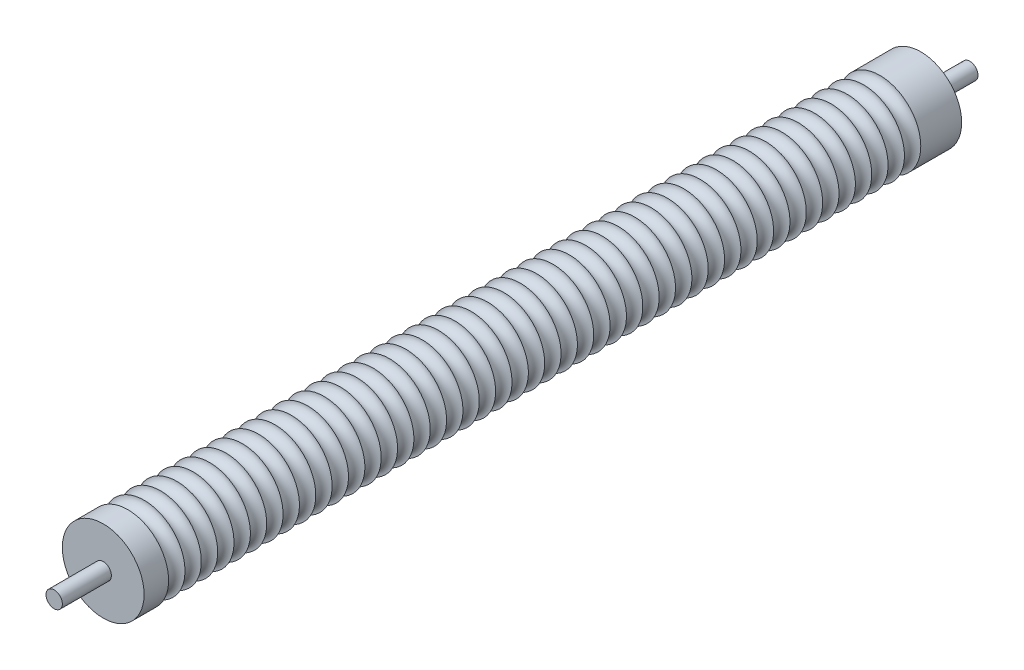
ISO-10303-21;
HEADER;
FILE_DESCRIPTION(('STEP AP214'),'2;1');
FILE_NAME('part.step','',(''),(''),'','','');
FILE_SCHEMA(('AUTOMOTIVE_DESIGN { 1 0 10303 214 1 1 1 1 }'));
ENDSEC;
DATA;
#1=APPLICATION_CONTEXT('core data for automotive mechanical design processes');
#2=APPLICATION_PROTOCOL_DEFINITION('international standard','automotive_design',2000,#1);
#3=PRODUCT_CONTEXT('',#1,'mechanical');
#4=PRODUCT('Part','Part','',(#3));
#5=PRODUCT_RELATED_PRODUCT_CATEGORY('part','',(#4));
#6=PRODUCT_DEFINITION_FORMATION('','',#4);
#7=PRODUCT_DEFINITION_CONTEXT('part definition',#1,'design');
#8=PRODUCT_DEFINITION('design','',#6,#7);
#9=PRODUCT_DEFINITION_SHAPE('','',#8);
#10=(LENGTH_UNIT() NAMED_UNIT(*) SI_UNIT(.MILLI.,.METRE.));
#11=(NAMED_UNIT(*) PLANE_ANGLE_UNIT() SI_UNIT($,.RADIAN.));
#12=(NAMED_UNIT(*) SI_UNIT($,.STERADIAN.) SOLID_ANGLE_UNIT());
#13=UNCERTAINTY_MEASURE_WITH_UNIT(LENGTH_MEASURE(1.E-05),#10,'distance_accuracy_value','');
#14=(GEOMETRIC_REPRESENTATION_CONTEXT(3) GLOBAL_UNCERTAINTY_ASSIGNED_CONTEXT((#13)) GLOBAL_UNIT_ASSIGNED_CONTEXT((#10,
#11,#12)) REPRESENTATION_CONTEXT('',''));
#15=CARTESIAN_POINT('',(0.,0.,0.));
#16=DIRECTION('',(0.,0.,1.));
#17=DIRECTION('',(1.,0.,0.));
#18=AXIS2_PLACEMENT_3D('',#15,#16,#17);
#19=CARTESIAN_POINT('',(1.17961196366423E-13,0.,960.));
#20=DIRECTION('',(0.,0.,-1.));
#21=DIRECTION('',(-1.,0.,0.));
#22=AXIS2_PLACEMENT_3D('',#19,#20,#21);
#23=TOROIDAL_SURFACE('',#22,50.0000000000001,10.);
#24=CARTESIAN_POINT('',(1.19210197269126E-13,0.,970.));
#25=DIRECTION('',(0.,0.,-1.));
#26=DIRECTION('',(-1.,0.,0.));
#27=AXIS2_PLACEMENT_3D('',#24,#25,#26);
#28=CIRCLE('',#27,50.);
#29=CARTESIAN_POINT('',(-49.9999999999999,0.,970.));
#30=VERTEX_POINT('',#29);
#31=EDGE_CURVE('E53',#30,#30,#28,.F.);
#32=ORIENTED_EDGE('',*,*,#31,.F.);
#33=EDGE_LOOP('',(#32));
#34=FACE_BOUND('',#33,.T.);
#35=CARTESIAN_POINT('',(1.17961196366423E-13,0.,950.));
#36=DIRECTION('',(0.,0.,-1.));
#37=DIRECTION('',(-1.,0.,0.));
#38=AXIS2_PLACEMENT_3D('',#35,#36,#37);
#39=CIRCLE('',#38,50.0000000000001);
#40=CARTESIAN_POINT('',(-50.,0.,950.));
#41=VERTEX_POINT('',#40);
#42=EDGE_CURVE('E67',#41,#41,#39,.T.);
#43=ORIENTED_EDGE('',*,*,#42,.F.);
#44=EDGE_LOOP('',(#43));
#45=FACE_BOUND('',#44,.T.);
#46=ADVANCED_FACE('F33',(#34,#45),#23,.F.);
#47=CARTESIAN_POINT('',(0.,0.,1000.));
#48=DIRECTION('',(0.,0.,1.));
#49=DIRECTION('',(1.,0.,0.));
#50=AXIS2_PLACEMENT_3D('',#47,#48,#49);
#51=PLANE('',#50);
#52=CARTESIAN_POINT('',(0.,0.,1000.));
#53=DIRECTION('',(0.,0.,1.));
#54=DIRECTION('',(1.,0.,0.));
#55=AXIS2_PLACEMENT_3D('',#52,#53,#54);
#56=CIRCLE('',#55,10.);
#57=CARTESIAN_POINT('',(10.,0.,1000.));
#58=VERTEX_POINT('',#57);
#59=EDGE_CURVE('E10',#58,#58,#56,.T.);
#60=ORIENTED_EDGE('',*,*,#59,.F.);
#61=EDGE_LOOP('',(#60));
#62=FACE_BOUND('',#61,.T.);
#63=CARTESIAN_POINT('',(0.,0.,1000.));
#64=DIRECTION('',(0.,0.,1.));
#65=DIRECTION('',(1.,0.,0.));
#66=AXIS2_PLACEMENT_3D('',#63,#64,#65);
#67=CIRCLE('',#66,50.);
#68=CARTESIAN_POINT('',(50.,0.,1000.));
#69=VERTEX_POINT('',#68);
#70=EDGE_CURVE('E41',#69,#69,#67,.T.);
#71=ORIENTED_EDGE('',*,*,#70,.T.);
#72=EDGE_LOOP('',(#71));
#73=FACE_BOUND('',#72,.T.);
#74=ADVANCED_FACE('F227',(#62,#73),#51,.T.);
#75=CARTESIAN_POINT('',(0.,0.,1000.));
#76=DIRECTION('',(0.,0.,-1.));
#77=DIRECTION('',(-1.,0.,0.));
#78=AXIS2_PLACEMENT_3D('',#75,#76,#77);
#79=CYLINDRICAL_SURFACE('',#78,50.);
#80=ORIENTED_EDGE('',*,*,#31,.T.);
#81=EDGE_LOOP('',(#80));
#82=FACE_BOUND('',#81,.T.);
#83=ORIENTED_EDGE('',*,*,#70,.F.);
#84=EDGE_LOOP('',(#83));
#85=FACE_BOUND('',#84,.T.);
#86=ADVANCED_FACE('F35',(#82,#85),#79,.T.);
#87=CARTESIAN_POINT('',(0.,0.,1060.));
#88=DIRECTION('',(0.,0.,-1.));
#89=DIRECTION('',(-1.,0.,0.));
#90=AXIS2_PLACEMENT_3D('',#87,#88,#89);
#91=CYLINDRICAL_SURFACE('',#90,10.);
#92=CARTESIAN_POINT('',(0.,0.,1060.));
#93=DIRECTION('',(0.,0.,1.));
#94=DIRECTION('',(1.,0.,0.));
#95=AXIS2_PLACEMENT_3D('',#92,#93,#94);
#96=CIRCLE('',#95,10.);
#97=CARTESIAN_POINT('',(10.,0.,1060.));
#98=VERTEX_POINT('',#97);
#99=EDGE_CURVE('E49',#98,#98,#96,.T.);
#100=ORIENTED_EDGE('',*,*,#99,.F.);
#101=EDGE_LOOP('',(#100));
#102=FACE_BOUND('',#101,.T.);
#103=ORIENTED_EDGE('',*,*,#59,.T.);
#104=EDGE_LOOP('',(#103));
#105=FACE_BOUND('',#104,.T.);
#106=ADVANCED_FACE('F237',(#102,#105),#91,.T.);
#107=CARTESIAN_POINT('',(0.,0.,1060.));
#108=DIRECTION('',(0.,0.,1.));
#109=DIRECTION('',(1.,0.,0.));
#110=AXIS2_PLACEMENT_3D('',#107,#108,#109);
#111=PLANE('',#110);
#112=ORIENTED_EDGE('',*,*,#99,.T.);
#113=EDGE_LOOP('',(#112));
#114=FACE_BOUND('',#113,.T.);
#115=ADVANCED_FACE('F254',(#114),#111,.T.);
#116=CARTESIAN_POINT('',(1.17961196366423E-13,0.,940.));
#117=DIRECTION('',(0.,0.,-1.));
#118=DIRECTION('',(-1.,0.,0.));
#119=AXIS2_PLACEMENT_3D('',#116,#117,#118);
#120=TOROIDAL_SURFACE('',#119,50.0000000000001,10.);
#121=ORIENTED_EDGE('',*,*,#42,.T.);
#122=EDGE_LOOP('',(#121));
#123=FACE_BOUND('',#122,.T.);
#124=CARTESIAN_POINT('',(1.19210197269126E-13,0.,930.));
#125=DIRECTION('',(0.,0.,-1.));
#126=DIRECTION('',(-1.,0.,0.));
#127=AXIS2_PLACEMENT_3D('',#124,#125,#126);
#128=CIRCLE('',#127,50.);
#129=CARTESIAN_POINT('',(-49.9999999999999,0.,930.));
#130=VERTEX_POINT('',#129);
#131=EDGE_CURVE('E71',#130,#130,#128,.F.);
#132=ORIENTED_EDGE('',*,*,#131,.T.);
#133=EDGE_LOOP('',(#132));
#134=FACE_BOUND('',#133,.T.);
#135=ADVANCED_FACE('F256',(#123,#134),#120,.F.);
#136=CARTESIAN_POINT('',(1.17961196366423E-13,0.,920.));
#137=DIRECTION('',(0.,0.,-1.));
#138=DIRECTION('',(-1.,0.,0.));
#139=AXIS2_PLACEMENT_3D('',#136,#137,#138);
#140=TOROIDAL_SURFACE('',#139,50.0000000000001,10.);
#141=ORIENTED_EDGE('',*,*,#131,.F.);
#142=EDGE_LOOP('',(#141));
#143=FACE_BOUND('',#142,.T.);
#144=CARTESIAN_POINT('',(1.19210197269126E-13,0.,910.));
#145=DIRECTION('',(0.,0.,-1.));
#146=DIRECTION('',(-1.,0.,0.));
#147=AXIS2_PLACEMENT_3D('',#144,#145,#146);
#148=CIRCLE('',#147,50.);
#149=CARTESIAN_POINT('',(-49.9999999999999,0.,910.));
#150=VERTEX_POINT('',#149);
#151=EDGE_CURVE('E74',#150,#150,#148,.F.);
#152=ORIENTED_EDGE('',*,*,#151,.T.);
#153=EDGE_LOOP('',(#152));
#154=FACE_BOUND('',#153,.T.);
#155=ADVANCED_FACE('F261',(#143,#154),#140,.F.);
#156=CARTESIAN_POINT('',(1.17961196366423E-13,0.,900.));
#157=DIRECTION('',(0.,0.,-1.));
#158=DIRECTION('',(-1.,0.,0.));
#159=AXIS2_PLACEMENT_3D('',#156,#157,#158);
#160=TOROIDAL_SURFACE('',#159,50.0000000000001,10.);
#161=ORIENTED_EDGE('',*,*,#151,.F.);
#162=EDGE_LOOP('',(#161));
#163=FACE_BOUND('',#162,.T.);
#164=CARTESIAN_POINT('',(1.19210197269126E-13,0.,890.));
#165=DIRECTION('',(0.,0.,-1.));
#166=DIRECTION('',(-1.,0.,0.));
#167=AXIS2_PLACEMENT_3D('',#164,#165,#166);
#168=CIRCLE('',#167,50.);
#169=CARTESIAN_POINT('',(-49.9999999999999,0.,890.));
#170=VERTEX_POINT('',#169);
#171=EDGE_CURVE('E77',#170,#170,#168,.F.);
#172=ORIENTED_EDGE('',*,*,#171,.T.);
#173=EDGE_LOOP('',(#172));
#174=FACE_BOUND('',#173,.T.);
#175=ADVANCED_FACE('F315',(#163,#174),#160,.F.);
#176=CARTESIAN_POINT('',(1.17961196366423E-13,0.,880.));
#177=DIRECTION('',(0.,0.,-1.));
#178=DIRECTION('',(-1.,0.,0.));
#179=AXIS2_PLACEMENT_3D('',#176,#177,#178);
#180=TOROIDAL_SURFACE('',#179,50.0000000000001,10.);
#181=ORIENTED_EDGE('',*,*,#171,.F.);
#182=EDGE_LOOP('',(#181));
#183=FACE_BOUND('',#182,.T.);
#184=CARTESIAN_POINT('',(1.19210197269126E-13,0.,870.));
#185=DIRECTION('',(0.,0.,-1.));
#186=DIRECTION('',(-1.,0.,0.));
#187=AXIS2_PLACEMENT_3D('',#184,#185,#186);
#188=CIRCLE('',#187,50.);
#189=CARTESIAN_POINT('',(-49.9999999999999,0.,870.));
#190=VERTEX_POINT('',#189);
#191=EDGE_CURVE('E80',#190,#190,#188,.F.);
#192=ORIENTED_EDGE('',*,*,#191,.T.);
#193=EDGE_LOOP('',(#192));
#194=FACE_BOUND('',#193,.T.);
#195=ADVANCED_FACE('F325',(#183,#194),#180,.F.);
#196=CARTESIAN_POINT('',(1.17961196366423E-13,0.,860.));
#197=DIRECTION('',(0.,0.,-1.));
#198=DIRECTION('',(-1.,0.,0.));
#199=AXIS2_PLACEMENT_3D('',#196,#197,#198);
#200=TOROIDAL_SURFACE('',#199,50.0000000000001,10.);
#201=ORIENTED_EDGE('',*,*,#191,.F.);
#202=EDGE_LOOP('',(#201));
#203=FACE_BOUND('',#202,.T.);
#204=CARTESIAN_POINT('',(1.19210197269126E-13,0.,850.));
#205=DIRECTION('',(0.,0.,-1.));
#206=DIRECTION('',(-1.,0.,0.));
#207=AXIS2_PLACEMENT_3D('',#204,#205,#206);
#208=CIRCLE('',#207,50.);
#209=CARTESIAN_POINT('',(-49.9999999999999,0.,850.));
#210=VERTEX_POINT('',#209);
#211=EDGE_CURVE('E83',#210,#210,#208,.F.);
#212=ORIENTED_EDGE('',*,*,#211,.T.);
#213=EDGE_LOOP('',(#212));
#214=FACE_BOUND('',#213,.T.);
#215=ADVANCED_FACE('F335',(#203,#214),#200,.F.);
#216=CARTESIAN_POINT('',(1.17961196366423E-13,0.,840.));
#217=DIRECTION('',(0.,0.,-1.));
#218=DIRECTION('',(-1.,0.,0.));
#219=AXIS2_PLACEMENT_3D('',#216,#217,#218);
#220=TOROIDAL_SURFACE('',#219,50.0000000000001,10.);
#221=ORIENTED_EDGE('',*,*,#211,.F.);
#222=EDGE_LOOP('',(#221));
#223=FACE_BOUND('',#222,.T.);
#224=CARTESIAN_POINT('',(1.19210197269126E-13,0.,830.));
#225=DIRECTION('',(0.,0.,-1.));
#226=DIRECTION('',(-1.,0.,0.));
#227=AXIS2_PLACEMENT_3D('',#224,#225,#226);
#228=CIRCLE('',#227,50.);
#229=CARTESIAN_POINT('',(-49.9999999999999,0.,830.));
#230=VERTEX_POINT('',#229);
#231=EDGE_CURVE('E86',#230,#230,#228,.F.);
#232=ORIENTED_EDGE('',*,*,#231,.T.);
#233=EDGE_LOOP('',(#232));
#234=FACE_BOUND('',#233,.T.);
#235=ADVANCED_FACE('F345',(#223,#234),#220,.F.);
#236=CARTESIAN_POINT('',(1.17961196366423E-13,0.,820.));
#237=DIRECTION('',(0.,0.,-1.));
#238=DIRECTION('',(-1.,0.,0.));
#239=AXIS2_PLACEMENT_3D('',#236,#237,#238);
#240=TOROIDAL_SURFACE('',#239,50.0000000000001,10.);
#241=ORIENTED_EDGE('',*,*,#231,.F.);
#242=EDGE_LOOP('',(#241));
#243=FACE_BOUND('',#242,.T.);
#244=CARTESIAN_POINT('',(1.19210197269126E-13,0.,810.));
#245=DIRECTION('',(0.,0.,-1.));
#246=DIRECTION('',(-1.,0.,0.));
#247=AXIS2_PLACEMENT_3D('',#244,#245,#246);
#248=CIRCLE('',#247,50.);
#249=CARTESIAN_POINT('',(-49.9999999999999,0.,810.));
#250=VERTEX_POINT('',#249);
#251=EDGE_CURVE('E89',#250,#250,#248,.F.);
#252=ORIENTED_EDGE('',*,*,#251,.T.);
#253=EDGE_LOOP('',(#252));
#254=FACE_BOUND('',#253,.T.);
#255=ADVANCED_FACE('F355',(#243,#254),#240,.F.);
#256=CARTESIAN_POINT('',(1.17961196366423E-13,0.,800.));
#257=DIRECTION('',(0.,0.,-1.));
#258=DIRECTION('',(-1.,0.,0.));
#259=AXIS2_PLACEMENT_3D('',#256,#257,#258);
#260=TOROIDAL_SURFACE('',#259,50.0000000000001,10.);
#261=ORIENTED_EDGE('',*,*,#251,.F.);
#262=EDGE_LOOP('',(#261));
#263=FACE_BOUND('',#262,.T.);
#264=CARTESIAN_POINT('',(1.19210197269126E-13,0.,790.));
#265=DIRECTION('',(0.,0.,-1.));
#266=DIRECTION('',(-1.,0.,0.));
#267=AXIS2_PLACEMENT_3D('',#264,#265,#266);
#268=CIRCLE('',#267,50.);
#269=CARTESIAN_POINT('',(-49.9999999999999,0.,790.));
#270=VERTEX_POINT('',#269);
#271=EDGE_CURVE('E92',#270,#270,#268,.F.);
#272=ORIENTED_EDGE('',*,*,#271,.T.);
#273=EDGE_LOOP('',(#272));
#274=FACE_BOUND('',#273,.T.);
#275=ADVANCED_FACE('F365',(#263,#274),#260,.F.);
#276=CARTESIAN_POINT('',(1.17961196366423E-13,0.,780.));
#277=DIRECTION('',(0.,0.,-1.));
#278=DIRECTION('',(-1.,0.,0.));
#279=AXIS2_PLACEMENT_3D('',#276,#277,#278);
#280=TOROIDAL_SURFACE('',#279,50.0000000000001,10.);
#281=ORIENTED_EDGE('',*,*,#271,.F.);
#282=EDGE_LOOP('',(#281));
#283=FACE_BOUND('',#282,.T.);
#284=CARTESIAN_POINT('',(1.19210197269126E-13,0.,770.));
#285=DIRECTION('',(0.,0.,-1.));
#286=DIRECTION('',(-1.,0.,0.));
#287=AXIS2_PLACEMENT_3D('',#284,#285,#286);
#288=CIRCLE('',#287,50.);
#289=CARTESIAN_POINT('',(-49.9999999999999,0.,770.));
#290=VERTEX_POINT('',#289);
#291=EDGE_CURVE('E95',#290,#290,#288,.F.);
#292=ORIENTED_EDGE('',*,*,#291,.T.);
#293=EDGE_LOOP('',(#292));
#294=FACE_BOUND('',#293,.T.);
#295=ADVANCED_FACE('F375',(#283,#294),#280,.F.);
#296=CARTESIAN_POINT('',(1.17961196366423E-13,0.,760.));
#297=DIRECTION('',(0.,0.,-1.));
#298=DIRECTION('',(-1.,0.,0.));
#299=AXIS2_PLACEMENT_3D('',#296,#297,#298);
#300=TOROIDAL_SURFACE('',#299,50.0000000000001,10.);
#301=ORIENTED_EDGE('',*,*,#291,.F.);
#302=EDGE_LOOP('',(#301));
#303=FACE_BOUND('',#302,.T.);
#304=CARTESIAN_POINT('',(1.19210197269126E-13,0.,750.));
#305=DIRECTION('',(0.,0.,-1.));
#306=DIRECTION('',(-1.,0.,0.));
#307=AXIS2_PLACEMENT_3D('',#304,#305,#306);
#308=CIRCLE('',#307,50.);
#309=CARTESIAN_POINT('',(-49.9999999999999,0.,750.));
#310=VERTEX_POINT('',#309);
#311=EDGE_CURVE('E98',#310,#310,#308,.F.);
#312=ORIENTED_EDGE('',*,*,#311,.T.);
#313=EDGE_LOOP('',(#312));
#314=FACE_BOUND('',#313,.T.);
#315=ADVANCED_FACE('F385',(#303,#314),#300,.F.);
#316=CARTESIAN_POINT('',(1.17961196366423E-13,0.,740.));
#317=DIRECTION('',(0.,0.,-1.));
#318=DIRECTION('',(-1.,0.,0.));
#319=AXIS2_PLACEMENT_3D('',#316,#317,#318);
#320=TOROIDAL_SURFACE('',#319,50.0000000000001,10.);
#321=ORIENTED_EDGE('',*,*,#311,.F.);
#322=EDGE_LOOP('',(#321));
#323=FACE_BOUND('',#322,.T.);
#324=CARTESIAN_POINT('',(1.19210197269126E-13,0.,730.));
#325=DIRECTION('',(0.,0.,-1.));
#326=DIRECTION('',(-1.,0.,0.));
#327=AXIS2_PLACEMENT_3D('',#324,#325,#326);
#328=CIRCLE('',#327,50.);
#329=CARTESIAN_POINT('',(-49.9999999999999,0.,730.));
#330=VERTEX_POINT('',#329);
#331=EDGE_CURVE('E101',#330,#330,#328,.F.);
#332=ORIENTED_EDGE('',*,*,#331,.T.);
#333=EDGE_LOOP('',(#332));
#334=FACE_BOUND('',#333,.T.);
#335=ADVANCED_FACE('F395',(#323,#334),#320,.F.);
#336=CARTESIAN_POINT('',(1.17961196366423E-13,0.,720.));
#337=DIRECTION('',(0.,0.,-1.));
#338=DIRECTION('',(-1.,0.,0.));
#339=AXIS2_PLACEMENT_3D('',#336,#337,#338);
#340=TOROIDAL_SURFACE('',#339,50.0000000000001,10.);
#341=ORIENTED_EDGE('',*,*,#331,.F.);
#342=EDGE_LOOP('',(#341));
#343=FACE_BOUND('',#342,.T.);
#344=CARTESIAN_POINT('',(1.19210197269126E-13,0.,710.));
#345=DIRECTION('',(0.,0.,-1.));
#346=DIRECTION('',(-1.,0.,0.));
#347=AXIS2_PLACEMENT_3D('',#344,#345,#346);
#348=CIRCLE('',#347,50.);
#349=CARTESIAN_POINT('',(-49.9999999999999,0.,710.));
#350=VERTEX_POINT('',#349);
#351=EDGE_CURVE('E104',#350,#350,#348,.F.);
#352=ORIENTED_EDGE('',*,*,#351,.T.);
#353=EDGE_LOOP('',(#352));
#354=FACE_BOUND('',#353,.T.);
#355=ADVANCED_FACE('F405',(#343,#354),#340,.F.);
#356=CARTESIAN_POINT('',(1.17961196366423E-13,0.,700.));
#357=DIRECTION('',(0.,0.,-1.));
#358=DIRECTION('',(-1.,0.,0.));
#359=AXIS2_PLACEMENT_3D('',#356,#357,#358);
#360=TOROIDAL_SURFACE('',#359,50.0000000000001,10.);
#361=ORIENTED_EDGE('',*,*,#351,.F.);
#362=EDGE_LOOP('',(#361));
#363=FACE_BOUND('',#362,.T.);
#364=CARTESIAN_POINT('',(1.19210197269126E-13,0.,690.));
#365=DIRECTION('',(0.,0.,-1.));
#366=DIRECTION('',(-1.,0.,0.));
#367=AXIS2_PLACEMENT_3D('',#364,#365,#366);
#368=CIRCLE('',#367,50.);
#369=CARTESIAN_POINT('',(-49.9999999999999,0.,690.));
#370=VERTEX_POINT('',#369);
#371=EDGE_CURVE('E107',#370,#370,#368,.F.);
#372=ORIENTED_EDGE('',*,*,#371,.T.);
#373=EDGE_LOOP('',(#372));
#374=FACE_BOUND('',#373,.T.);
#375=ADVANCED_FACE('F415',(#363,#374),#360,.F.);
#376=CARTESIAN_POINT('',(1.17961196366423E-13,0.,680.));
#377=DIRECTION('',(0.,0.,-1.));
#378=DIRECTION('',(-1.,0.,0.));
#379=AXIS2_PLACEMENT_3D('',#376,#377,#378);
#380=TOROIDAL_SURFACE('',#379,50.0000000000001,10.);
#381=ORIENTED_EDGE('',*,*,#371,.F.);
#382=EDGE_LOOP('',(#381));
#383=FACE_BOUND('',#382,.T.);
#384=CARTESIAN_POINT('',(1.19210197269126E-13,0.,670.));
#385=DIRECTION('',(0.,0.,-1.));
#386=DIRECTION('',(-1.,0.,0.));
#387=AXIS2_PLACEMENT_3D('',#384,#385,#386);
#388=CIRCLE('',#387,50.);
#389=CARTESIAN_POINT('',(-49.9999999999999,0.,670.));
#390=VERTEX_POINT('',#389);
#391=EDGE_CURVE('E110',#390,#390,#388,.F.);
#392=ORIENTED_EDGE('',*,*,#391,.T.);
#393=EDGE_LOOP('',(#392));
#394=FACE_BOUND('',#393,.T.);
#395=ADVANCED_FACE('F425',(#383,#394),#380,.F.);
#396=CARTESIAN_POINT('',(1.17961196366423E-13,0.,660.));
#397=DIRECTION('',(0.,0.,-1.));
#398=DIRECTION('',(-1.,0.,0.));
#399=AXIS2_PLACEMENT_3D('',#396,#397,#398);
#400=TOROIDAL_SURFACE('',#399,50.0000000000001,10.);
#401=ORIENTED_EDGE('',*,*,#391,.F.);
#402=EDGE_LOOP('',(#401));
#403=FACE_BOUND('',#402,.T.);
#404=CARTESIAN_POINT('',(1.19210197269126E-13,0.,650.));
#405=DIRECTION('',(0.,0.,-1.));
#406=DIRECTION('',(-1.,0.,0.));
#407=AXIS2_PLACEMENT_3D('',#404,#405,#406);
#408=CIRCLE('',#407,50.);
#409=CARTESIAN_POINT('',(-49.9999999999999,0.,650.));
#410=VERTEX_POINT('',#409);
#411=EDGE_CURVE('E113',#410,#410,#408,.F.);
#412=ORIENTED_EDGE('',*,*,#411,.T.);
#413=EDGE_LOOP('',(#412));
#414=FACE_BOUND('',#413,.T.);
#415=ADVANCED_FACE('F435',(#403,#414),#400,.F.);
#416=CARTESIAN_POINT('',(1.17961196366423E-13,0.,640.));
#417=DIRECTION('',(0.,0.,-1.));
#418=DIRECTION('',(-1.,0.,0.));
#419=AXIS2_PLACEMENT_3D('',#416,#417,#418);
#420=TOROIDAL_SURFACE('',#419,50.0000000000001,10.);
#421=ORIENTED_EDGE('',*,*,#411,.F.);
#422=EDGE_LOOP('',(#421));
#423=FACE_BOUND('',#422,.T.);
#424=CARTESIAN_POINT('',(1.19210197269126E-13,0.,630.));
#425=DIRECTION('',(0.,0.,-1.));
#426=DIRECTION('',(-1.,0.,0.));
#427=AXIS2_PLACEMENT_3D('',#424,#425,#426);
#428=CIRCLE('',#427,50.);
#429=CARTESIAN_POINT('',(-49.9999999999999,0.,630.));
#430=VERTEX_POINT('',#429);
#431=EDGE_CURVE('E116',#430,#430,#428,.F.);
#432=ORIENTED_EDGE('',*,*,#431,.T.);
#433=EDGE_LOOP('',(#432));
#434=FACE_BOUND('',#433,.T.);
#435=ADVANCED_FACE('F445',(#423,#434),#420,.F.);
#436=CARTESIAN_POINT('',(1.17961196366423E-13,0.,620.));
#437=DIRECTION('',(0.,0.,-1.));
#438=DIRECTION('',(-1.,0.,0.));
#439=AXIS2_PLACEMENT_3D('',#436,#437,#438);
#440=TOROIDAL_SURFACE('',#439,50.0000000000001,10.);
#441=ORIENTED_EDGE('',*,*,#431,.F.);
#442=EDGE_LOOP('',(#441));
#443=FACE_BOUND('',#442,.T.);
#444=CARTESIAN_POINT('',(1.19210197269126E-13,0.,610.));
#445=DIRECTION('',(0.,0.,-1.));
#446=DIRECTION('',(-1.,0.,0.));
#447=AXIS2_PLACEMENT_3D('',#444,#445,#446);
#448=CIRCLE('',#447,50.);
#449=CARTESIAN_POINT('',(-49.9999999999999,0.,610.));
#450=VERTEX_POINT('',#449);
#451=EDGE_CURVE('E119',#450,#450,#448,.F.);
#452=ORIENTED_EDGE('',*,*,#451,.T.);
#453=EDGE_LOOP('',(#452));
#454=FACE_BOUND('',#453,.T.);
#455=ADVANCED_FACE('F455',(#443,#454),#440,.F.);
#456=CARTESIAN_POINT('',(1.17961196366423E-13,0.,600.));
#457=DIRECTION('',(0.,0.,-1.));
#458=DIRECTION('',(-1.,0.,0.));
#459=AXIS2_PLACEMENT_3D('',#456,#457,#458);
#460=TOROIDAL_SURFACE('',#459,50.0000000000001,10.);
#461=ORIENTED_EDGE('',*,*,#451,.F.);
#462=EDGE_LOOP('',(#461));
#463=FACE_BOUND('',#462,.T.);
#464=CARTESIAN_POINT('',(1.19210197269126E-13,0.,590.));
#465=DIRECTION('',(0.,0.,-1.));
#466=DIRECTION('',(-1.,0.,0.));
#467=AXIS2_PLACEMENT_3D('',#464,#465,#466);
#468=CIRCLE('',#467,50.);
#469=CARTESIAN_POINT('',(-49.9999999999999,0.,590.));
#470=VERTEX_POINT('',#469);
#471=EDGE_CURVE('E122',#470,#470,#468,.F.);
#472=ORIENTED_EDGE('',*,*,#471,.T.);
#473=EDGE_LOOP('',(#472));
#474=FACE_BOUND('',#473,.T.);
#475=ADVANCED_FACE('F465',(#463,#474),#460,.F.);
#476=CARTESIAN_POINT('',(1.17961196366423E-13,0.,580.));
#477=DIRECTION('',(0.,0.,-1.));
#478=DIRECTION('',(-1.,0.,0.));
#479=AXIS2_PLACEMENT_3D('',#476,#477,#478);
#480=TOROIDAL_SURFACE('',#479,50.0000000000001,10.);
#481=ORIENTED_EDGE('',*,*,#471,.F.);
#482=EDGE_LOOP('',(#481));
#483=FACE_BOUND('',#482,.T.);
#484=CARTESIAN_POINT('',(1.19210197269126E-13,0.,570.));
#485=DIRECTION('',(0.,0.,-1.));
#486=DIRECTION('',(-1.,0.,0.));
#487=AXIS2_PLACEMENT_3D('',#484,#485,#486);
#488=CIRCLE('',#487,50.);
#489=CARTESIAN_POINT('',(-49.9999999999999,0.,570.));
#490=VERTEX_POINT('',#489);
#491=EDGE_CURVE('E125',#490,#490,#488,.F.);
#492=ORIENTED_EDGE('',*,*,#491,.T.);
#493=EDGE_LOOP('',(#492));
#494=FACE_BOUND('',#493,.T.);
#495=ADVANCED_FACE('F475',(#483,#494),#480,.F.);
#496=CARTESIAN_POINT('',(1.17961196366423E-13,0.,560.));
#497=DIRECTION('',(0.,0.,-1.));
#498=DIRECTION('',(-1.,0.,0.));
#499=AXIS2_PLACEMENT_3D('',#496,#497,#498);
#500=TOROIDAL_SURFACE('',#499,50.0000000000001,10.);
#501=ORIENTED_EDGE('',*,*,#491,.F.);
#502=EDGE_LOOP('',(#501));
#503=FACE_BOUND('',#502,.T.);
#504=CARTESIAN_POINT('',(1.19210197269126E-13,0.,550.));
#505=DIRECTION('',(0.,0.,-1.));
#506=DIRECTION('',(-1.,0.,0.));
#507=AXIS2_PLACEMENT_3D('',#504,#505,#506);
#508=CIRCLE('',#507,50.);
#509=CARTESIAN_POINT('',(-49.9999999999999,0.,550.));
#510=VERTEX_POINT('',#509);
#511=EDGE_CURVE('E128',#510,#510,#508,.F.);
#512=ORIENTED_EDGE('',*,*,#511,.T.);
#513=EDGE_LOOP('',(#512));
#514=FACE_BOUND('',#513,.T.);
#515=ADVANCED_FACE('F485',(#503,#514),#500,.F.);
#516=CARTESIAN_POINT('',(1.17961196366423E-13,0.,540.));
#517=DIRECTION('',(0.,0.,-1.));
#518=DIRECTION('',(-1.,0.,0.));
#519=AXIS2_PLACEMENT_3D('',#516,#517,#518);
#520=TOROIDAL_SURFACE('',#519,50.0000000000001,10.);
#521=ORIENTED_EDGE('',*,*,#511,.F.);
#522=EDGE_LOOP('',(#521));
#523=FACE_BOUND('',#522,.T.);
#524=CARTESIAN_POINT('',(1.19210197269126E-13,0.,530.));
#525=DIRECTION('',(0.,0.,-1.));
#526=DIRECTION('',(-1.,0.,0.));
#527=AXIS2_PLACEMENT_3D('',#524,#525,#526);
#528=CIRCLE('',#527,50.);
#529=CARTESIAN_POINT('',(-49.9999999999999,0.,530.));
#530=VERTEX_POINT('',#529);
#531=EDGE_CURVE('E131',#530,#530,#528,.F.);
#532=ORIENTED_EDGE('',*,*,#531,.T.);
#533=EDGE_LOOP('',(#532));
#534=FACE_BOUND('',#533,.T.);
#535=ADVANCED_FACE('F495',(#523,#534),#520,.F.);
#536=CARTESIAN_POINT('',(1.17961196366423E-13,0.,520.));
#537=DIRECTION('',(0.,0.,-1.));
#538=DIRECTION('',(-1.,0.,0.));
#539=AXIS2_PLACEMENT_3D('',#536,#537,#538);
#540=TOROIDAL_SURFACE('',#539,50.0000000000001,10.);
#541=ORIENTED_EDGE('',*,*,#531,.F.);
#542=EDGE_LOOP('',(#541));
#543=FACE_BOUND('',#542,.T.);
#544=CARTESIAN_POINT('',(1.19210197269126E-13,0.,510.));
#545=DIRECTION('',(0.,0.,-1.));
#546=DIRECTION('',(-1.,0.,0.));
#547=AXIS2_PLACEMENT_3D('',#544,#545,#546);
#548=CIRCLE('',#547,50.);
#549=CARTESIAN_POINT('',(-49.9999999999999,0.,510.));
#550=VERTEX_POINT('',#549);
#551=EDGE_CURVE('E134',#550,#550,#548,.F.);
#552=ORIENTED_EDGE('',*,*,#551,.T.);
#553=EDGE_LOOP('',(#552));
#554=FACE_BOUND('',#553,.T.);
#555=ADVANCED_FACE('F505',(#543,#554),#540,.F.);
#556=CARTESIAN_POINT('',(1.17961196366423E-13,0.,500.));
#557=DIRECTION('',(0.,0.,-1.));
#558=DIRECTION('',(-1.,0.,0.));
#559=AXIS2_PLACEMENT_3D('',#556,#557,#558);
#560=TOROIDAL_SURFACE('',#559,50.0000000000001,10.);
#561=ORIENTED_EDGE('',*,*,#551,.F.);
#562=EDGE_LOOP('',(#561));
#563=FACE_BOUND('',#562,.T.);
#564=CARTESIAN_POINT('',(1.19210197269126E-13,0.,490.));
#565=DIRECTION('',(0.,0.,-1.));
#566=DIRECTION('',(-1.,0.,0.));
#567=AXIS2_PLACEMENT_3D('',#564,#565,#566);
#568=CIRCLE('',#567,50.);
#569=CARTESIAN_POINT('',(-49.9999999999999,0.,490.));
#570=VERTEX_POINT('',#569);
#571=EDGE_CURVE('E137',#570,#570,#568,.F.);
#572=ORIENTED_EDGE('',*,*,#571,.T.);
#573=EDGE_LOOP('',(#572));
#574=FACE_BOUND('',#573,.T.);
#575=ADVANCED_FACE('F515',(#563,#574),#560,.F.);
#576=CARTESIAN_POINT('',(1.17961196366423E-13,0.,480.));
#577=DIRECTION('',(0.,0.,-1.));
#578=DIRECTION('',(-1.,0.,0.));
#579=AXIS2_PLACEMENT_3D('',#576,#577,#578);
#580=TOROIDAL_SURFACE('',#579,50.0000000000001,10.);
#581=ORIENTED_EDGE('',*,*,#571,.F.);
#582=EDGE_LOOP('',(#581));
#583=FACE_BOUND('',#582,.T.);
#584=CARTESIAN_POINT('',(1.19210197269126E-13,0.,470.));
#585=DIRECTION('',(0.,0.,-1.));
#586=DIRECTION('',(-1.,0.,0.));
#587=AXIS2_PLACEMENT_3D('',#584,#585,#586);
#588=CIRCLE('',#587,50.);
#589=CARTESIAN_POINT('',(-49.9999999999999,0.,470.));
#590=VERTEX_POINT('',#589);
#591=EDGE_CURVE('E140',#590,#590,#588,.F.);
#592=ORIENTED_EDGE('',*,*,#591,.T.);
#593=EDGE_LOOP('',(#592));
#594=FACE_BOUND('',#593,.T.);
#595=ADVANCED_FACE('F525',(#583,#594),#580,.F.);
#596=CARTESIAN_POINT('',(1.17961196366423E-13,0.,460.));
#597=DIRECTION('',(0.,0.,-1.));
#598=DIRECTION('',(-1.,0.,0.));
#599=AXIS2_PLACEMENT_3D('',#596,#597,#598);
#600=TOROIDAL_SURFACE('',#599,50.0000000000001,10.);
#601=ORIENTED_EDGE('',*,*,#591,.F.);
#602=EDGE_LOOP('',(#601));
#603=FACE_BOUND('',#602,.T.);
#604=CARTESIAN_POINT('',(1.19210197269126E-13,0.,450.));
#605=DIRECTION('',(0.,0.,-1.));
#606=DIRECTION('',(-1.,0.,0.));
#607=AXIS2_PLACEMENT_3D('',#604,#605,#606);
#608=CIRCLE('',#607,50.);
#609=CARTESIAN_POINT('',(-49.9999999999999,0.,450.));
#610=VERTEX_POINT('',#609);
#611=EDGE_CURVE('E143',#610,#610,#608,.F.);
#612=ORIENTED_EDGE('',*,*,#611,.T.);
#613=EDGE_LOOP('',(#612));
#614=FACE_BOUND('',#613,.T.);
#615=ADVANCED_FACE('F535',(#603,#614),#600,.F.);
#616=CARTESIAN_POINT('',(1.17961196366423E-13,0.,440.));
#617=DIRECTION('',(0.,0.,-1.));
#618=DIRECTION('',(-1.,0.,0.));
#619=AXIS2_PLACEMENT_3D('',#616,#617,#618);
#620=TOROIDAL_SURFACE('',#619,50.0000000000001,10.);
#621=ORIENTED_EDGE('',*,*,#611,.F.);
#622=EDGE_LOOP('',(#621));
#623=FACE_BOUND('',#622,.T.);
#624=CARTESIAN_POINT('',(1.19210197269126E-13,0.,430.));
#625=DIRECTION('',(0.,0.,-1.));
#626=DIRECTION('',(-1.,0.,0.));
#627=AXIS2_PLACEMENT_3D('',#624,#625,#626);
#628=CIRCLE('',#627,50.);
#629=CARTESIAN_POINT('',(-49.9999999999999,0.,430.));
#630=VERTEX_POINT('',#629);
#631=EDGE_CURVE('E146',#630,#630,#628,.F.);
#632=ORIENTED_EDGE('',*,*,#631,.T.);
#633=EDGE_LOOP('',(#632));
#634=FACE_BOUND('',#633,.T.);
#635=ADVANCED_FACE('F545',(#623,#634),#620,.F.);
#636=CARTESIAN_POINT('',(1.17961196366423E-13,0.,420.));
#637=DIRECTION('',(0.,0.,-1.));
#638=DIRECTION('',(-1.,0.,0.));
#639=AXIS2_PLACEMENT_3D('',#636,#637,#638);
#640=TOROIDAL_SURFACE('',#639,50.0000000000001,10.);
#641=ORIENTED_EDGE('',*,*,#631,.F.);
#642=EDGE_LOOP('',(#641));
#643=FACE_BOUND('',#642,.T.);
#644=CARTESIAN_POINT('',(1.19210197269126E-13,0.,410.));
#645=DIRECTION('',(0.,0.,-1.));
#646=DIRECTION('',(-1.,0.,0.));
#647=AXIS2_PLACEMENT_3D('',#644,#645,#646);
#648=CIRCLE('',#647,50.);
#649=CARTESIAN_POINT('',(-49.9999999999999,0.,410.));
#650=VERTEX_POINT('',#649);
#651=EDGE_CURVE('E149',#650,#650,#648,.F.);
#652=ORIENTED_EDGE('',*,*,#651,.T.);
#653=EDGE_LOOP('',(#652));
#654=FACE_BOUND('',#653,.T.);
#655=ADVANCED_FACE('F555',(#643,#654),#640,.F.);
#656=CARTESIAN_POINT('',(1.17961196366423E-13,0.,400.));
#657=DIRECTION('',(0.,0.,-1.));
#658=DIRECTION('',(-1.,0.,0.));
#659=AXIS2_PLACEMENT_3D('',#656,#657,#658);
#660=TOROIDAL_SURFACE('',#659,50.0000000000001,10.);
#661=ORIENTED_EDGE('',*,*,#651,.F.);
#662=EDGE_LOOP('',(#661));
#663=FACE_BOUND('',#662,.T.);
#664=CARTESIAN_POINT('',(1.19210197269126E-13,0.,390.));
#665=DIRECTION('',(0.,0.,-1.));
#666=DIRECTION('',(-1.,0.,0.));
#667=AXIS2_PLACEMENT_3D('',#664,#665,#666);
#668=CIRCLE('',#667,50.);
#669=CARTESIAN_POINT('',(-49.9999999999999,0.,390.));
#670=VERTEX_POINT('',#669);
#671=EDGE_CURVE('E152',#670,#670,#668,.F.);
#672=ORIENTED_EDGE('',*,*,#671,.T.);
#673=EDGE_LOOP('',(#672));
#674=FACE_BOUND('',#673,.T.);
#675=ADVANCED_FACE('F565',(#663,#674),#660,.F.);
#676=CARTESIAN_POINT('',(1.17961196366423E-13,0.,380.));
#677=DIRECTION('',(0.,0.,-1.));
#678=DIRECTION('',(-1.,0.,0.));
#679=AXIS2_PLACEMENT_3D('',#676,#677,#678);
#680=TOROIDAL_SURFACE('',#679,50.0000000000001,10.);
#681=ORIENTED_EDGE('',*,*,#671,.F.);
#682=EDGE_LOOP('',(#681));
#683=FACE_BOUND('',#682,.T.);
#684=CARTESIAN_POINT('',(1.19210197269126E-13,0.,370.));
#685=DIRECTION('',(0.,0.,-1.));
#686=DIRECTION('',(-1.,0.,0.));
#687=AXIS2_PLACEMENT_3D('',#684,#685,#686);
#688=CIRCLE('',#687,50.);
#689=CARTESIAN_POINT('',(-49.9999999999999,0.,370.));
#690=VERTEX_POINT('',#689);
#691=EDGE_CURVE('E155',#690,#690,#688,.F.);
#692=ORIENTED_EDGE('',*,*,#691,.T.);
#693=EDGE_LOOP('',(#692));
#694=FACE_BOUND('',#693,.T.);
#695=ADVANCED_FACE('F575',(#683,#694),#680,.F.);
#696=CARTESIAN_POINT('',(1.17961196366423E-13,0.,360.));
#697=DIRECTION('',(0.,0.,-1.));
#698=DIRECTION('',(-1.,0.,0.));
#699=AXIS2_PLACEMENT_3D('',#696,#697,#698);
#700=TOROIDAL_SURFACE('',#699,50.0000000000001,10.);
#701=ORIENTED_EDGE('',*,*,#691,.F.);
#702=EDGE_LOOP('',(#701));
#703=FACE_BOUND('',#702,.T.);
#704=CARTESIAN_POINT('',(1.19210197269126E-13,0.,350.));
#705=DIRECTION('',(0.,0.,-1.));
#706=DIRECTION('',(-1.,0.,0.));
#707=AXIS2_PLACEMENT_3D('',#704,#705,#706);
#708=CIRCLE('',#707,50.);
#709=CARTESIAN_POINT('',(-49.9999999999999,0.,350.));
#710=VERTEX_POINT('',#709);
#711=EDGE_CURVE('E158',#710,#710,#708,.F.);
#712=ORIENTED_EDGE('',*,*,#711,.T.);
#713=EDGE_LOOP('',(#712));
#714=FACE_BOUND('',#713,.T.);
#715=ADVANCED_FACE('F585',(#703,#714),#700,.F.);
#716=CARTESIAN_POINT('',(1.17961196366423E-13,0.,340.));
#717=DIRECTION('',(0.,0.,-1.));
#718=DIRECTION('',(-1.,0.,0.));
#719=AXIS2_PLACEMENT_3D('',#716,#717,#718);
#720=TOROIDAL_SURFACE('',#719,50.0000000000001,10.);
#721=ORIENTED_EDGE('',*,*,#711,.F.);
#722=EDGE_LOOP('',(#721));
#723=FACE_BOUND('',#722,.T.);
#724=CARTESIAN_POINT('',(1.19210197269126E-13,0.,330.));
#725=DIRECTION('',(0.,0.,-1.));
#726=DIRECTION('',(-1.,0.,0.));
#727=AXIS2_PLACEMENT_3D('',#724,#725,#726);
#728=CIRCLE('',#727,50.);
#729=CARTESIAN_POINT('',(-49.9999999999999,0.,330.));
#730=VERTEX_POINT('',#729);
#731=EDGE_CURVE('E161',#730,#730,#728,.F.);
#732=ORIENTED_EDGE('',*,*,#731,.T.);
#733=EDGE_LOOP('',(#732));
#734=FACE_BOUND('',#733,.T.);
#735=ADVANCED_FACE('F595',(#723,#734),#720,.F.);
#736=CARTESIAN_POINT('',(1.17961196366423E-13,0.,320.));
#737=DIRECTION('',(0.,0.,-1.));
#738=DIRECTION('',(-1.,0.,0.));
#739=AXIS2_PLACEMENT_3D('',#736,#737,#738);
#740=TOROIDAL_SURFACE('',#739,50.0000000000001,10.);
#741=ORIENTED_EDGE('',*,*,#731,.F.);
#742=EDGE_LOOP('',(#741));
#743=FACE_BOUND('',#742,.T.);
#744=CARTESIAN_POINT('',(1.19210197269126E-13,0.,310.));
#745=DIRECTION('',(0.,0.,-1.));
#746=DIRECTION('',(-1.,0.,0.));
#747=AXIS2_PLACEMENT_3D('',#744,#745,#746);
#748=CIRCLE('',#747,50.);
#749=CARTESIAN_POINT('',(-49.9999999999999,0.,310.));
#750=VERTEX_POINT('',#749);
#751=EDGE_CURVE('E164',#750,#750,#748,.F.);
#752=ORIENTED_EDGE('',*,*,#751,.T.);
#753=EDGE_LOOP('',(#752));
#754=FACE_BOUND('',#753,.T.);
#755=ADVANCED_FACE('F605',(#743,#754),#740,.F.);
#756=CARTESIAN_POINT('',(1.17961196366423E-13,0.,300.));
#757=DIRECTION('',(0.,0.,-1.));
#758=DIRECTION('',(-1.,0.,0.));
#759=AXIS2_PLACEMENT_3D('',#756,#757,#758);
#760=TOROIDAL_SURFACE('',#759,50.0000000000001,10.);
#761=ORIENTED_EDGE('',*,*,#751,.F.);
#762=EDGE_LOOP('',(#761));
#763=FACE_BOUND('',#762,.T.);
#764=CARTESIAN_POINT('',(1.19210197269126E-13,0.,290.));
#765=DIRECTION('',(0.,0.,-1.));
#766=DIRECTION('',(-1.,0.,0.));
#767=AXIS2_PLACEMENT_3D('',#764,#765,#766);
#768=CIRCLE('',#767,50.);
#769=CARTESIAN_POINT('',(-49.9999999999999,0.,290.));
#770=VERTEX_POINT('',#769);
#771=EDGE_CURVE('E167',#770,#770,#768,.F.);
#772=ORIENTED_EDGE('',*,*,#771,.T.);
#773=EDGE_LOOP('',(#772));
#774=FACE_BOUND('',#773,.T.);
#775=ADVANCED_FACE('F615',(#763,#774),#760,.F.);
#776=CARTESIAN_POINT('',(1.17961196366423E-13,0.,280.));
#777=DIRECTION('',(0.,0.,-1.));
#778=DIRECTION('',(-1.,0.,0.));
#779=AXIS2_PLACEMENT_3D('',#776,#777,#778);
#780=TOROIDAL_SURFACE('',#779,50.0000000000001,10.);
#781=ORIENTED_EDGE('',*,*,#771,.F.);
#782=EDGE_LOOP('',(#781));
#783=FACE_BOUND('',#782,.T.);
#784=CARTESIAN_POINT('',(1.19210197269126E-13,0.,270.));
#785=DIRECTION('',(0.,0.,-1.));
#786=DIRECTION('',(-1.,0.,0.));
#787=AXIS2_PLACEMENT_3D('',#784,#785,#786);
#788=CIRCLE('',#787,50.);
#789=CARTESIAN_POINT('',(-49.9999999999999,0.,270.));
#790=VERTEX_POINT('',#789);
#791=EDGE_CURVE('E170',#790,#790,#788,.F.);
#792=ORIENTED_EDGE('',*,*,#791,.T.);
#793=EDGE_LOOP('',(#792));
#794=FACE_BOUND('',#793,.T.);
#795=ADVANCED_FACE('F625',(#783,#794),#780,.F.);
#796=CARTESIAN_POINT('',(1.17961196366423E-13,0.,260.));
#797=DIRECTION('',(0.,0.,-1.));
#798=DIRECTION('',(-1.,0.,0.));
#799=AXIS2_PLACEMENT_3D('',#796,#797,#798);
#800=TOROIDAL_SURFACE('',#799,50.0000000000001,10.);
#801=ORIENTED_EDGE('',*,*,#791,.F.);
#802=EDGE_LOOP('',(#801));
#803=FACE_BOUND('',#802,.T.);
#804=CARTESIAN_POINT('',(1.19210197269126E-13,0.,250.));
#805=DIRECTION('',(0.,0.,-1.));
#806=DIRECTION('',(-1.,0.,0.));
#807=AXIS2_PLACEMENT_3D('',#804,#805,#806);
#808=CIRCLE('',#807,50.);
#809=CARTESIAN_POINT('',(-49.9999999999999,0.,250.));
#810=VERTEX_POINT('',#809);
#811=EDGE_CURVE('E173',#810,#810,#808,.F.);
#812=ORIENTED_EDGE('',*,*,#811,.T.);
#813=EDGE_LOOP('',(#812));
#814=FACE_BOUND('',#813,.T.);
#815=ADVANCED_FACE('F635',(#803,#814),#800,.F.);
#816=CARTESIAN_POINT('',(1.17961196366423E-13,0.,240.));
#817=DIRECTION('',(0.,0.,-1.));
#818=DIRECTION('',(-1.,0.,0.));
#819=AXIS2_PLACEMENT_3D('',#816,#817,#818);
#820=TOROIDAL_SURFACE('',#819,50.0000000000001,10.);
#821=ORIENTED_EDGE('',*,*,#811,.F.);
#822=EDGE_LOOP('',(#821));
#823=FACE_BOUND('',#822,.T.);
#824=CARTESIAN_POINT('',(1.19210197269126E-13,0.,230.));
#825=DIRECTION('',(0.,0.,-1.));
#826=DIRECTION('',(-1.,0.,0.));
#827=AXIS2_PLACEMENT_3D('',#824,#825,#826);
#828=CIRCLE('',#827,50.);
#829=CARTESIAN_POINT('',(-49.9999999999999,0.,230.));
#830=VERTEX_POINT('',#829);
#831=EDGE_CURVE('E176',#830,#830,#828,.F.);
#832=ORIENTED_EDGE('',*,*,#831,.T.);
#833=EDGE_LOOP('',(#832));
#834=FACE_BOUND('',#833,.T.);
#835=ADVANCED_FACE('F645',(#823,#834),#820,.F.);
#836=CARTESIAN_POINT('',(1.17961196366423E-13,0.,220.));
#837=DIRECTION('',(0.,0.,-1.));
#838=DIRECTION('',(-1.,0.,0.));
#839=AXIS2_PLACEMENT_3D('',#836,#837,#838);
#840=TOROIDAL_SURFACE('',#839,50.0000000000001,10.);
#841=ORIENTED_EDGE('',*,*,#831,.F.);
#842=EDGE_LOOP('',(#841));
#843=FACE_BOUND('',#842,.T.);
#844=CARTESIAN_POINT('',(1.19210197269126E-13,0.,210.));
#845=DIRECTION('',(0.,0.,-1.));
#846=DIRECTION('',(-1.,0.,0.));
#847=AXIS2_PLACEMENT_3D('',#844,#845,#846);
#848=CIRCLE('',#847,50.);
#849=CARTESIAN_POINT('',(-49.9999999999999,0.,210.));
#850=VERTEX_POINT('',#849);
#851=EDGE_CURVE('E179',#850,#850,#848,.F.);
#852=ORIENTED_EDGE('',*,*,#851,.T.);
#853=EDGE_LOOP('',(#852));
#854=FACE_BOUND('',#853,.T.);
#855=ADVANCED_FACE('F655',(#843,#854),#840,.F.);
#856=CARTESIAN_POINT('',(1.17961196366423E-13,0.,200.));
#857=DIRECTION('',(0.,0.,-1.));
#858=DIRECTION('',(-1.,0.,0.));
#859=AXIS2_PLACEMENT_3D('',#856,#857,#858);
#860=TOROIDAL_SURFACE('',#859,50.0000000000001,10.);
#861=ORIENTED_EDGE('',*,*,#851,.F.);
#862=EDGE_LOOP('',(#861));
#863=FACE_BOUND('',#862,.T.);
#864=CARTESIAN_POINT('',(1.19210197269126E-13,0.,190.));
#865=DIRECTION('',(0.,0.,-1.));
#866=DIRECTION('',(-1.,0.,0.));
#867=AXIS2_PLACEMENT_3D('',#864,#865,#866);
#868=CIRCLE('',#867,50.);
#869=CARTESIAN_POINT('',(-49.9999999999999,0.,190.));
#870=VERTEX_POINT('',#869);
#871=EDGE_CURVE('E182',#870,#870,#868,.F.);
#872=ORIENTED_EDGE('',*,*,#871,.T.);
#873=EDGE_LOOP('',(#872));
#874=FACE_BOUND('',#873,.T.);
#875=ADVANCED_FACE('F665',(#863,#874),#860,.F.);
#876=CARTESIAN_POINT('',(1.17961196366423E-13,0.,180.));
#877=DIRECTION('',(0.,0.,-1.));
#878=DIRECTION('',(-1.,0.,0.));
#879=AXIS2_PLACEMENT_3D('',#876,#877,#878);
#880=TOROIDAL_SURFACE('',#879,50.0000000000001,10.);
#881=ORIENTED_EDGE('',*,*,#871,.F.);
#882=EDGE_LOOP('',(#881));
#883=FACE_BOUND('',#882,.T.);
#884=CARTESIAN_POINT('',(1.19210197269126E-13,0.,170.));
#885=DIRECTION('',(0.,0.,-1.));
#886=DIRECTION('',(-1.,0.,0.));
#887=AXIS2_PLACEMENT_3D('',#884,#885,#886);
#888=CIRCLE('',#887,50.);
#889=CARTESIAN_POINT('',(-49.9999999999999,0.,170.));
#890=VERTEX_POINT('',#889);
#891=EDGE_CURVE('E185',#890,#890,#888,.F.);
#892=ORIENTED_EDGE('',*,*,#891,.T.);
#893=EDGE_LOOP('',(#892));
#894=FACE_BOUND('',#893,.T.);
#895=ADVANCED_FACE('F675',(#883,#894),#880,.F.);
#896=CARTESIAN_POINT('',(1.17961196366423E-13,0.,160.));
#897=DIRECTION('',(0.,0.,-1.));
#898=DIRECTION('',(-1.,0.,0.));
#899=AXIS2_PLACEMENT_3D('',#896,#897,#898);
#900=TOROIDAL_SURFACE('',#899,50.0000000000001,10.);
#901=ORIENTED_EDGE('',*,*,#891,.F.);
#902=EDGE_LOOP('',(#901));
#903=FACE_BOUND('',#902,.T.);
#904=CARTESIAN_POINT('',(1.19210197269126E-13,1.00335166762301E-13,150.));
#905=DIRECTION('',(0.,0.,-1.));
#906=DIRECTION('',(-1.,0.,0.));
#907=AXIS2_PLACEMENT_3D('',#904,#905,#906);
#908=CIRCLE('',#907,50.);
#909=CARTESIAN_POINT('',(-49.9999999999999,1.00335166762301E-13,150.));
#910=VERTEX_POINT('',#909);
#911=EDGE_CURVE('E188',#910,#910,#908,.F.);
#912=ORIENTED_EDGE('',*,*,#911,.T.);
#913=EDGE_LOOP('',(#912));
#914=FACE_BOUND('',#913,.T.);
#915=ADVANCED_FACE('F685',(#903,#914),#900,.F.);
#916=CARTESIAN_POINT('',(1.17961196366423E-13,1.00335166762301E-13,140.));
#917=DIRECTION('',(0.,0.,-1.));
#918=DIRECTION('',(-1.,0.,0.));
#919=AXIS2_PLACEMENT_3D('',#916,#917,#918);
#920=TOROIDAL_SURFACE('',#919,50.0000000000001,10.);
#921=ORIENTED_EDGE('',*,*,#911,.F.);
#922=EDGE_LOOP('',(#921));
#923=FACE_BOUND('',#922,.T.);
#924=CARTESIAN_POINT('',(1.19210197269126E-13,1.02782365951626E-13,130.));
#925=DIRECTION('',(0.,0.,-1.));
#926=DIRECTION('',(-1.,0.,0.));
#927=AXIS2_PLACEMENT_3D('',#924,#925,#926);
#928=CIRCLE('',#927,50.);
#929=CARTESIAN_POINT('',(-49.9999999999999,1.02782365951626E-13,130.));
#930=VERTEX_POINT('',#929);
#931=EDGE_CURVE('E191',#930,#930,#928,.F.);
#932=ORIENTED_EDGE('',*,*,#931,.T.);
#933=EDGE_LOOP('',(#932));
#934=FACE_BOUND('',#933,.T.);
#935=ADVANCED_FACE('F695',(#923,#934),#920,.F.);
#936=CARTESIAN_POINT('',(1.17961196366423E-13,1.02782365951626E-13,120.));
#937=DIRECTION('',(0.,0.,-1.));
#938=DIRECTION('',(-1.,0.,0.));
#939=AXIS2_PLACEMENT_3D('',#936,#937,#938);
#940=TOROIDAL_SURFACE('',#939,50.0000000000001,10.);
#941=ORIENTED_EDGE('',*,*,#931,.F.);
#942=EDGE_LOOP('',(#941));
#943=FACE_BOUND('',#942,.T.);
#944=CARTESIAN_POINT('',(1.19210197269126E-13,1.0522956514095E-13,110.));
#945=DIRECTION('',(0.,0.,-1.));
#946=DIRECTION('',(-1.,0.,0.));
#947=AXIS2_PLACEMENT_3D('',#944,#945,#946);
#948=CIRCLE('',#947,50.);
#949=CARTESIAN_POINT('',(-49.9999999999999,1.0522956514095E-13,110.));
#950=VERTEX_POINT('',#949);
#951=EDGE_CURVE('E194',#950,#950,#948,.F.);
#952=ORIENTED_EDGE('',*,*,#951,.T.);
#953=EDGE_LOOP('',(#952));
#954=FACE_BOUND('',#953,.T.);
#955=ADVANCED_FACE('F705',(#943,#954),#940,.F.);
#956=CARTESIAN_POINT('',(1.17961196366423E-13,1.0522956514095E-13,100.));
#957=DIRECTION('',(0.,0.,-1.));
#958=DIRECTION('',(-1.,0.,0.));
#959=AXIS2_PLACEMENT_3D('',#956,#957,#958);
#960=TOROIDAL_SURFACE('',#959,50.0000000000001,10.);
#961=ORIENTED_EDGE('',*,*,#951,.F.);
#962=EDGE_LOOP('',(#961));
#963=FACE_BOUND('',#962,.T.);
#964=CARTESIAN_POINT('',(1.19210197269126E-13,1.07676764330275E-13,90.));
#965=DIRECTION('',(0.,0.,-1.));
#966=DIRECTION('',(-1.,0.,0.));
#967=AXIS2_PLACEMENT_3D('',#964,#965,#966);
#968=CIRCLE('',#967,50.);
#969=CARTESIAN_POINT('',(-49.9999999999999,1.07676764330275E-13,90.));
#970=VERTEX_POINT('',#969);
#971=EDGE_CURVE('E197',#970,#970,#968,.F.);
#972=ORIENTED_EDGE('',*,*,#971,.T.);
#973=EDGE_LOOP('',(#972));
#974=FACE_BOUND('',#973,.T.);
#975=ADVANCED_FACE('F223',(#963,#974),#960,.F.);
#976=CARTESIAN_POINT('',(1.17961196366423E-13,1.07676764330275E-13,80.));
#977=DIRECTION('',(0.,0.,-1.));
#978=DIRECTION('',(-1.,0.,0.));
#979=AXIS2_PLACEMENT_3D('',#976,#977,#978);
#980=TOROIDAL_SURFACE('',#979,50.0000000000001,10.);
#981=ORIENTED_EDGE('',*,*,#971,.F.);
#982=EDGE_LOOP('',(#981));
#983=FACE_BOUND('',#982,.T.);
#984=CARTESIAN_POINT('',(1.19210197269126E-13,1.10123963519599E-13,70.));
#985=DIRECTION('',(0.,0.,-1.));
#986=DIRECTION('',(-1.,0.,0.));
#987=AXIS2_PLACEMENT_3D('',#984,#985,#986);
#988=CIRCLE('',#987,50.);
#989=CARTESIAN_POINT('',(-49.9999999999999,1.10123963519599E-13,70.));
#990=VERTEX_POINT('',#989);
#991=EDGE_CURVE('E200',#990,#990,#988,.F.);
#992=ORIENTED_EDGE('',*,*,#991,.T.);
#993=EDGE_LOOP('',(#992));
#994=FACE_BOUND('',#993,.T.);
#995=ADVANCED_FACE('F213',(#983,#994),#980,.F.);
#996=CARTESIAN_POINT('',(1.17961196366423E-13,1.10123963519599E-13,59.9999999999999));
#997=DIRECTION('',(0.,0.,-1.));
#998=DIRECTION('',(-1.,0.,0.));
#999=AXIS2_PLACEMENT_3D('',#996,#997,#998);
#1000=TOROIDAL_SURFACE('',#999,50.0000000000001,10.);
#1001=ORIENTED_EDGE('',*,*,#991,.F.);
#1002=EDGE_LOOP('',(#1001));
#1003=FACE_BOUND('',#1002,.T.);
#1004=CARTESIAN_POINT('',(1.1671219546372E-13,1.10123963519599E-13,49.9999999999999));
#1005=DIRECTION('',(0.,0.,1.));
#1006=DIRECTION('',(1.,0.,0.));
#1007=AXIS2_PLACEMENT_3D('',#1004,#1005,#1006);
#1008=CIRCLE('',#1007,50.);
#1009=CARTESIAN_POINT('',(50.0000000000001,1.10123963519599E-13,49.9999999999999));
#1010=VERTEX_POINT('',#1009);
#1011=EDGE_CURVE('E37',#1010,#1010,#1008,.F.);
#1012=ORIENTED_EDGE('',*,*,#1011,.F.);
#1013=EDGE_LOOP('',(#1012));
#1014=FACE_BOUND('',#1013,.T.);
#1015=ADVANCED_FACE('F210',(#1003,#1014),#1000,.F.);
#1016=CARTESIAN_POINT('',(0.,0.,-60.));
#1017=DIRECTION('',(0.,0.,-1.));
#1018=DIRECTION('',(1.,0.,0.));
#1019=AXIS2_PLACEMENT_3D('',#1016,#1017,#1018);
#1020=PLANE('',#1019);
#1021=CARTESIAN_POINT('',(0.,0.,-60.));
#1022=DIRECTION('',(0.,0.,1.));
#1023=DIRECTION('',(1.,0.,0.));
#1024=AXIS2_PLACEMENT_3D('',#1021,#1022,#1023);
#1025=CIRCLE('',#1024,10.);
#1026=CARTESIAN_POINT('',(10.,0.,-60.));
#1027=VERTEX_POINT('',#1026);
#1028=EDGE_CURVE('E58',#1027,#1027,#1025,.T.);
#1029=ORIENTED_EDGE('',*,*,#1028,.F.);
#1030=EDGE_LOOP('',(#1029));
#1031=FACE_BOUND('',#1030,.T.);
#1032=ADVANCED_FACE('F212',(#1031),#1020,.T.);
#1033=CARTESIAN_POINT('',(0.,0.,-60.));
#1034=DIRECTION('',(0.,0.,1.));
#1035=DIRECTION('',(1.,0.,0.));
#1036=AXIS2_PLACEMENT_3D('',#1033,#1034,#1035);
#1037=CYLINDRICAL_SURFACE('',#1036,10.);
#1038=ORIENTED_EDGE('',*,*,#1028,.T.);
#1039=EDGE_LOOP('',(#1038));
#1040=FACE_BOUND('',#1039,.T.);
#1041=CARTESIAN_POINT('',(0.,0.,0.));
#1042=DIRECTION('',(0.,0.,1.));
#1043=DIRECTION('',(1.,0.,0.));
#1044=AXIS2_PLACEMENT_3D('',#1041,#1042,#1043);
#1045=CIRCLE('',#1044,10.);
#1046=CARTESIAN_POINT('',(10.,0.,0.));
#1047=VERTEX_POINT('',#1046);
#1048=EDGE_CURVE('E62',#1047,#1047,#1045,.T.);
#1049=ORIENTED_EDGE('',*,*,#1048,.F.);
#1050=EDGE_LOOP('',(#1049));
#1051=FACE_BOUND('',#1050,.T.);
#1052=ADVANCED_FACE('F220',(#1040,#1051),#1037,.T.);
#1053=CARTESIAN_POINT('',(0.,0.,0.));
#1054=DIRECTION('',(0.,0.,1.));
#1055=DIRECTION('',(1.,0.,0.));
#1056=AXIS2_PLACEMENT_3D('',#1053,#1054,#1055);
#1057=PLANE('',#1056);
#1058=ORIENTED_EDGE('',*,*,#1048,.T.);
#1059=EDGE_LOOP('',(#1058));
#1060=FACE_BOUND('',#1059,.T.);
#1061=CARTESIAN_POINT('',(0.,0.,0.));
#1062=DIRECTION('',(0.,0.,1.));
#1063=DIRECTION('',(1.,0.,0.));
#1064=AXIS2_PLACEMENT_3D('',#1061,#1062,#1063);
#1065=CIRCLE('',#1064,50.);
#1066=CARTESIAN_POINT('',(50.,0.,0.));
#1067=VERTEX_POINT('',#1066);
#1068=EDGE_CURVE('E46',#1067,#1067,#1065,.T.);
#1069=ORIENTED_EDGE('',*,*,#1068,.F.);
#1070=EDGE_LOOP('',(#1069));
#1071=FACE_BOUND('',#1070,.T.);
#1072=ADVANCED_FACE('F239',(#1060,#1071),#1057,.F.);
#1073=ORIENTED_EDGE('',*,*,#1011,.T.);
#1074=EDGE_LOOP('',(#1073));
#1075=FACE_BOUND('',#1074,.T.);
#1076=ORIENTED_EDGE('',*,*,#1068,.T.);
#1077=EDGE_LOOP('',(#1076));
#1078=FACE_BOUND('',#1077,.T.);
#1079=ADVANCED_FACE('F207',(#1075,#1078),#79,.T.);
#1080=CLOSED_SHELL('',(#46,#74,#86,#106,#115,#135,#155,#175,#195,#215,#235,#255,#275,#295,#315,
#335,#355,#375,#395,#415,#435,#455,#475,#495,#515,#535,#555,#575,#595,#615,#635,#655,#675,#695,
#715,#735,#755,#775,#795,#815,#835,#855,#875,#895,#915,#935,#955,#975,#995,#1015,#1032,#1052,
#1072,#1079));
#1081=MANIFOLD_SOLID_BREP('B2',#1080);
#1082=ADVANCED_BREP_SHAPE_REPRESENTATION('',(#18,#1081),#14);
#1083=SHAPE_DEFINITION_REPRESENTATION(#9,#1082);
ENDSEC;
END-ISO-10303-21;
